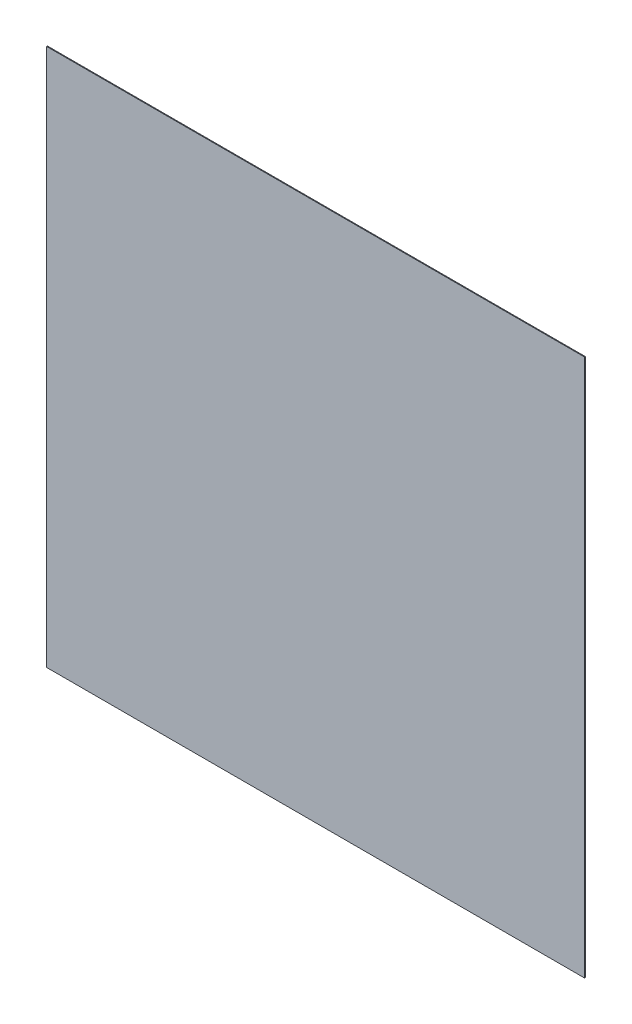
ISO-10303-21;
HEADER;
FILE_DESCRIPTION(('STEP AP214'),'2;1');
FILE_NAME('part.step','',(''),(''),'','','');
FILE_SCHEMA(('AUTOMOTIVE_DESIGN { 1 0 10303 214 1 1 1 1 }'));
ENDSEC;
DATA;
#1=APPLICATION_CONTEXT('core data for automotive mechanical design processes');
#2=APPLICATION_PROTOCOL_DEFINITION('international standard','automotive_design',2000,#1);
#3=PRODUCT_CONTEXT('',#1,'mechanical');
#4=PRODUCT('Part','Part','',(#3));
#5=PRODUCT_RELATED_PRODUCT_CATEGORY('part','',(#4));
#6=PRODUCT_DEFINITION_FORMATION('','',#4);
#7=PRODUCT_DEFINITION_CONTEXT('part definition',#1,'design');
#8=PRODUCT_DEFINITION('design','',#6,#7);
#9=PRODUCT_DEFINITION_SHAPE('','',#8);
#10=(LENGTH_UNIT() NAMED_UNIT(*) SI_UNIT(.MILLI.,.METRE.));
#11=(NAMED_UNIT(*) PLANE_ANGLE_UNIT() SI_UNIT($,.RADIAN.));
#12=(NAMED_UNIT(*) SI_UNIT($,.STERADIAN.) SOLID_ANGLE_UNIT());
#13=UNCERTAINTY_MEASURE_WITH_UNIT(LENGTH_MEASURE(1.E-05),#10,'distance_accuracy_value','');
#14=(GEOMETRIC_REPRESENTATION_CONTEXT(3) GLOBAL_UNCERTAINTY_ASSIGNED_CONTEXT((#13)) GLOBAL_UNIT_ASSIGNED_CONTEXT((#10,
#11,#12)) REPRESENTATION_CONTEXT('',''));
#15=CARTESIAN_POINT('',(0.,0.,0.));
#16=DIRECTION('',(0.,0.,1.));
#17=DIRECTION('',(1.,0.,0.));
#18=AXIS2_PLACEMENT_3D('',#15,#16,#17);
#19=CARTESIAN_POINT('',(-10.,10.,0.03));
#20=DIRECTION('',(1.,0.,0.));
#21=DIRECTION('',(0.,0.,-1.));
#22=AXIS2_PLACEMENT_3D('',#19,#20,#21);
#23=PLANE('',#22);
#24=DIRECTION('',(0.,-1.,0.));
#25=VECTOR('',#24,1.);
#26=CARTESIAN_POINT('',(-10.,10.,0.));
#27=LINE('',#26,#25);
#28=CARTESIAN_POINT('',(-10.,10.,0.));
#29=VERTEX_POINT('',#28);
#30=CARTESIAN_POINT('',(-10.,-10.,0.));
#31=VERTEX_POINT('',#30);
#32=EDGE_CURVE('E96',#29,#31,#27,.T.);
#33=ORIENTED_EDGE('',*,*,#32,.T.);
#34=DIRECTION('',(0.,0.,-1.));
#35=VECTOR('',#34,1.);
#36=CARTESIAN_POINT('',(-10.,-10.,0.03));
#37=LINE('',#36,#35);
#38=CARTESIAN_POINT('',(-10.,-10.,0.03));
#39=VERTEX_POINT('',#38);
#40=EDGE_CURVE('E11',#39,#31,#37,.T.);
#41=ORIENTED_EDGE('',*,*,#40,.F.);
#42=DIRECTION('',(0.,-1.,0.));
#43=VECTOR('',#42,1.);
#44=CARTESIAN_POINT('',(-10.,10.,0.03));
#45=LINE('',#44,#43);
#46=CARTESIAN_POINT('',(-10.,10.,0.03));
#47=VERTEX_POINT('',#46);
#48=EDGE_CURVE('E84',#47,#39,#45,.T.);
#49=ORIENTED_EDGE('',*,*,#48,.F.);
#50=DIRECTION('',(0.,0.,-1.));
#51=VECTOR('',#50,1.);
#52=CARTESIAN_POINT('',(-10.,10.,0.03));
#53=LINE('',#52,#51);
#54=EDGE_CURVE('E92',#47,#29,#53,.T.);
#55=ORIENTED_EDGE('',*,*,#54,.T.);
#56=EDGE_LOOP('',(#33,#41,#49,#55));
#57=FACE_BOUND('',#56,.T.);
#58=ADVANCED_FACE('F33',(#57),#23,.F.);
#59=CARTESIAN_POINT('',(-10.,-10.,0.03));
#60=DIRECTION('',(0.,1.,0.));
#61=DIRECTION('',(0.,0.,1.));
#62=AXIS2_PLACEMENT_3D('',#59,#60,#61);
#63=PLANE('',#62);
#64=DIRECTION('',(1.,0.,0.));
#65=VECTOR('',#64,1.);
#66=CARTESIAN_POINT('',(-10.,-10.,0.));
#67=LINE('',#66,#65);
#68=CARTESIAN_POINT('',(10.,-10.,0.));
#69=VERTEX_POINT('',#68);
#70=EDGE_CURVE('E88',#31,#69,#67,.T.);
#71=ORIENTED_EDGE('',*,*,#70,.T.);
#72=DIRECTION('',(0.,0.,-1.));
#73=VECTOR('',#72,1.);
#74=CARTESIAN_POINT('',(10.,-10.,0.03));
#75=LINE('',#74,#73);
#76=CARTESIAN_POINT('',(10.,-10.,0.03));
#77=VERTEX_POINT('',#76);
#78=EDGE_CURVE('E41',#77,#69,#75,.T.);
#79=ORIENTED_EDGE('',*,*,#78,.F.);
#80=DIRECTION('',(1.,0.,0.));
#81=VECTOR('',#80,1.);
#82=CARTESIAN_POINT('',(-10.,-10.,0.03));
#83=LINE('',#82,#81);
#84=EDGE_CURVE('E79',#39,#77,#83,.T.);
#85=ORIENTED_EDGE('',*,*,#84,.F.);
#86=ORIENTED_EDGE('',*,*,#40,.T.);
#87=EDGE_LOOP('',(#71,#79,#85,#86));
#88=FACE_BOUND('',#87,.T.);
#89=ADVANCED_FACE('F87',(#88),#63,.F.);
#90=CARTESIAN_POINT('',(10.,10.,0.03));
#91=DIRECTION('',(-1.,0.,0.));
#92=DIRECTION('',(0.,0.,1.));
#93=AXIS2_PLACEMENT_3D('',#90,#91,#92);
#94=PLANE('',#93);
#95=DIRECTION('',(0.,1.,0.));
#96=VECTOR('',#95,1.);
#97=CARTESIAN_POINT('',(10.,10.,0.));
#98=LINE('',#97,#96);
#99=CARTESIAN_POINT('',(10.,10.,0.));
#100=VERTEX_POINT('',#99);
#101=EDGE_CURVE('E66',#69,#100,#98,.T.);
#102=ORIENTED_EDGE('',*,*,#101,.T.);
#103=DIRECTION('',(0.,0.,-1.));
#104=VECTOR('',#103,1.);
#105=CARTESIAN_POINT('',(10.,10.,0.03));
#106=LINE('',#105,#104);
#107=CARTESIAN_POINT('',(10.,10.,0.03));
#108=VERTEX_POINT('',#107);
#109=EDGE_CURVE('E89',#108,#100,#106,.T.);
#110=ORIENTED_EDGE('',*,*,#109,.F.);
#111=DIRECTION('',(0.,1.,0.));
#112=VECTOR('',#111,1.);
#113=CARTESIAN_POINT('',(10.,10.,0.03));
#114=LINE('',#113,#112);
#115=EDGE_CURVE('E82',#77,#108,#114,.T.);
#116=ORIENTED_EDGE('',*,*,#115,.F.);
#117=ORIENTED_EDGE('',*,*,#78,.T.);
#118=EDGE_LOOP('',(#102,#110,#116,#117));
#119=FACE_BOUND('',#118,.T.);
#120=ADVANCED_FACE('F90',(#119),#94,.F.);
#121=CARTESIAN_POINT('',(-10.,10.,0.03));
#122=DIRECTION('',(0.,-1.,0.));
#123=DIRECTION('',(0.,0.,-1.));
#124=AXIS2_PLACEMENT_3D('',#121,#122,#123);
#125=PLANE('',#124);
#126=DIRECTION('',(-1.,0.,0.));
#127=VECTOR('',#126,1.);
#128=CARTESIAN_POINT('',(-10.,10.,0.));
#129=LINE('',#128,#127);
#130=EDGE_CURVE('E72',#100,#29,#129,.T.);
#131=ORIENTED_EDGE('',*,*,#130,.T.);
#132=ORIENTED_EDGE('',*,*,#54,.F.);
#133=DIRECTION('',(-1.,0.,0.));
#134=VECTOR('',#133,1.);
#135=CARTESIAN_POINT('',(-10.,10.,0.03));
#136=LINE('',#135,#134);
#137=EDGE_CURVE('E49',#108,#47,#136,.T.);
#138=ORIENTED_EDGE('',*,*,#137,.F.);
#139=ORIENTED_EDGE('',*,*,#109,.T.);
#140=EDGE_LOOP('',(#131,#132,#138,#139));
#141=FACE_BOUND('',#140,.T.);
#142=ADVANCED_FACE('F103',(#141),#125,.F.);
#143=CARTESIAN_POINT('',(0.,0.,0.03));
#144=DIRECTION('',(0.,0.,1.));
#145=DIRECTION('',(1.,0.,0.));
#146=AXIS2_PLACEMENT_3D('',#143,#144,#145);
#147=PLANE('',#146);
#148=ORIENTED_EDGE('',*,*,#48,.T.);
#149=ORIENTED_EDGE('',*,*,#84,.T.);
#150=ORIENTED_EDGE('',*,*,#115,.T.);
#151=ORIENTED_EDGE('',*,*,#137,.T.);
#152=EDGE_LOOP('',(#148,#149,#150,#151));
#153=FACE_BOUND('',#152,.T.);
#154=ADVANCED_FACE('F80',(#153),#147,.T.);
#155=CARTESIAN_POINT('',(0.,0.,0.));
#156=DIRECTION('',(0.,0.,1.));
#157=DIRECTION('',(1.,0.,0.));
#158=AXIS2_PLACEMENT_3D('',#155,#156,#157);
#159=PLANE('',#158);
#160=ORIENTED_EDGE('',*,*,#32,.F.);
#161=ORIENTED_EDGE('',*,*,#130,.F.);
#162=ORIENTED_EDGE('',*,*,#101,.F.);
#163=ORIENTED_EDGE('',*,*,#70,.F.);
#164=EDGE_LOOP('',(#160,#161,#162,#163));
#165=FACE_BOUND('',#164,.T.);
#166=ADVANCED_FACE('F106',(#165),#159,.F.);
#167=CLOSED_SHELL('',(#58,#89,#120,#142,#154,#166));
#168=MANIFOLD_SOLID_BREP('B2',#167);
#169=ADVANCED_BREP_SHAPE_REPRESENTATION('',(#18,#168),#14);
#170=SHAPE_DEFINITION_REPRESENTATION(#9,#169);
ENDSEC;
END-ISO-10303-21;
